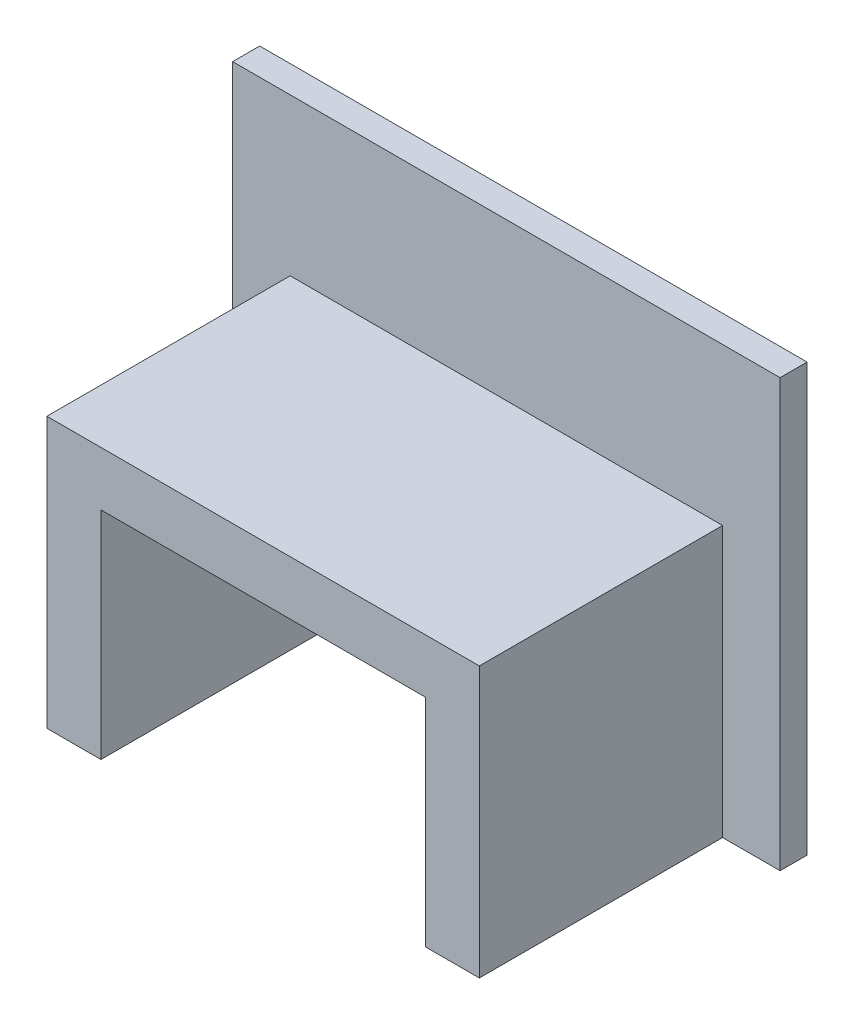
ISO-10303-21;
HEADER;
FILE_DESCRIPTION(('STEP AP214'),'2;1');
FILE_NAME('part.step','',(''),(''),'','','');
FILE_SCHEMA(('AUTOMOTIVE_DESIGN { 1 0 10303 214 1 1 1 1 }'));
ENDSEC;
DATA;
#1=APPLICATION_CONTEXT('core data for automotive mechanical design processes');
#2=APPLICATION_PROTOCOL_DEFINITION('international standard','automotive_design',2000,#1);
#3=PRODUCT_CONTEXT('',#1,'mechanical');
#4=PRODUCT('Part','Part','',(#3));
#5=PRODUCT_RELATED_PRODUCT_CATEGORY('part','',(#4));
#6=PRODUCT_DEFINITION_FORMATION('','',#4);
#7=PRODUCT_DEFINITION_CONTEXT('part definition',#1,'design');
#8=PRODUCT_DEFINITION('design','',#6,#7);
#9=PRODUCT_DEFINITION_SHAPE('','',#8);
#10=(LENGTH_UNIT() NAMED_UNIT(*) SI_UNIT(.MILLI.,.METRE.));
#11=(NAMED_UNIT(*) PLANE_ANGLE_UNIT() SI_UNIT($,.RADIAN.));
#12=(NAMED_UNIT(*) SI_UNIT($,.STERADIAN.) SOLID_ANGLE_UNIT());
#13=UNCERTAINTY_MEASURE_WITH_UNIT(LENGTH_MEASURE(1.E-05),#10,'distance_accuracy_value','');
#14=(GEOMETRIC_REPRESENTATION_CONTEXT(3) GLOBAL_UNCERTAINTY_ASSIGNED_CONTEXT((#13)) GLOBAL_UNIT_ASSIGNED_CONTEXT((#10,
#11,#12)) REPRESENTATION_CONTEXT('',''));
#15=CARTESIAN_POINT('',(0.,0.,0.));
#16=DIRECTION('',(0.,0.,1.));
#17=DIRECTION('',(1.,0.,0.));
#18=AXIS2_PLACEMENT_3D('',#15,#16,#17);
#19=CARTESIAN_POINT('',(6.,0.,-103.864963878906));
#20=DIRECTION('',(0.,1.,0.));
#21=DIRECTION('',(-1.,0.,0.));
#22=AXIS2_PLACEMENT_3D('',#19,#20,#21);
#23=PLANE('',#22);
#24=DIRECTION('',(0.,0.,-1.));
#25=VECTOR('',#24,1.);
#26=CARTESIAN_POINT('',(8.,0.,454.944607989649));
#27=LINE('',#26,#25);
#28=CARTESIAN_POINT('',(8.,0.,-103.864963878906));
#29=VERTEX_POINT('',#28);
#30=CARTESIAN_POINT('',(8.,0.,-112.864963878906));
#31=VERTEX_POINT('',#30);
#32=EDGE_CURVE('E150',#29,#31,#27,.T.);
#33=ORIENTED_EDGE('',*,*,#32,.F.);
#34=DIRECTION('',(1.,0.,0.));
#35=VECTOR('',#34,1.);
#36=CARTESIAN_POINT('',(6.,0.,-103.864963878906));
#37=LINE('',#36,#35);
#38=CARTESIAN_POINT('',(6.,0.,-103.864963878906));
#39=VERTEX_POINT('',#38);
#40=EDGE_CURVE('E170',#39,#29,#37,.T.);
#41=ORIENTED_EDGE('',*,*,#40,.F.);
#42=DIRECTION('',(0.,0.,-1.));
#43=VECTOR('',#42,1.);
#44=CARTESIAN_POINT('',(6.,0.,-103.864963878906));
#45=LINE('',#44,#43);
#46=CARTESIAN_POINT('',(6.,0.,-113.864963878905));
#47=VERTEX_POINT('',#46);
#48=EDGE_CURVE('E178',#39,#47,#45,.T.);
#49=ORIENTED_EDGE('',*,*,#48,.T.);
#50=DIRECTION('',(1.,0.,0.));
#51=VECTOR('',#50,1.);
#52=CARTESIAN_POINT('',(6.,0.,-113.864963878905));
#53=LINE('',#52,#51);
#54=CARTESIAN_POINT('',(10.1269763394667,0.,-113.864963878905));
#55=VERTEX_POINT('',#54);
#56=EDGE_CURVE('E179',#47,#55,#53,.T.);
#57=ORIENTED_EDGE('',*,*,#56,.T.);
#58=DIRECTION('',(0.,0.,-1.));
#59=VECTOR('',#58,1.);
#60=CARTESIAN_POINT('',(10.1269763394667,0.,-103.864963878906));
#61=LINE('',#60,#59);
#62=CARTESIAN_POINT('',(10.1269763394667,0.,-112.864963878906));
#63=VERTEX_POINT('',#62);
#64=EDGE_CURVE('E11',#63,#55,#61,.T.);
#65=ORIENTED_EDGE('',*,*,#64,.F.);
#66=DIRECTION('',(1.,0.,0.));
#67=VECTOR('',#66,1.);
#68=CARTESIAN_POINT('',(6.,0.,-112.864963878906));
#69=LINE('',#68,#67);
#70=EDGE_CURVE('E161',#31,#63,#69,.T.);
#71=ORIENTED_EDGE('',*,*,#70,.F.);
#72=EDGE_LOOP('',(#33,#41,#49,#57,#65,#71));
#73=FACE_BOUND('',#72,.T.);
#74=ADVANCED_FACE('F34',(#73),#23,.F.);
#75=CARTESIAN_POINT('',(10.1269763394667,0.,-103.864963878906));
#76=DIRECTION('',(-1.,0.,0.));
#77=DIRECTION('',(0.,-1.,0.));
#78=AXIS2_PLACEMENT_3D('',#75,#76,#77);
#79=PLANE('',#78);
#80=DIRECTION('',(0.,1.,0.));
#81=VECTOR('',#80,1.);
#82=CARTESIAN_POINT('',(10.1269763394667,0.,-112.864963878906));
#83=LINE('',#82,#81);
#84=CARTESIAN_POINT('',(10.1269763394663,15.8,-112.864963878906));
#85=VERTEX_POINT('',#84);
#86=EDGE_CURVE('E163',#63,#85,#83,.T.);
#87=ORIENTED_EDGE('',*,*,#86,.F.);
#88=ORIENTED_EDGE('',*,*,#64,.T.);
#89=DIRECTION('',(0.,1.,0.));
#90=VECTOR('',#89,1.);
#91=CARTESIAN_POINT('',(10.1269763394667,0.,-113.864963878905));
#92=LINE('',#91,#90);
#93=CARTESIAN_POINT('',(10.1269763394663,15.8,-113.864963878905));
#94=VERTEX_POINT('',#93);
#95=EDGE_CURVE('E182',#55,#94,#92,.T.);
#96=ORIENTED_EDGE('',*,*,#95,.T.);
#97=DIRECTION('',(0.,0.,-1.));
#98=VECTOR('',#97,1.);
#99=CARTESIAN_POINT('',(10.1269763394663,15.8,-103.864963878906));
#100=LINE('',#99,#98);
#101=EDGE_CURVE('E41',#85,#94,#100,.T.);
#102=ORIENTED_EDGE('',*,*,#101,.F.);
#103=EDGE_LOOP('',(#87,#88,#96,#102));
#104=FACE_BOUND('',#103,.T.);
#105=ADVANCED_FACE('F220',(#104),#79,.F.);
#106=CARTESIAN_POINT('',(10.1269763394663,15.8,-103.864963878906));
#107=DIRECTION('',(0.,-1.,0.));
#108=DIRECTION('',(0.,0.,-1.));
#109=AXIS2_PLACEMENT_3D('',#106,#107,#108);
#110=PLANE('',#109);
#111=DIRECTION('',(-1.,0.,0.));
#112=VECTOR('',#111,1.);
#113=CARTESIAN_POINT('',(10.1269763394663,15.8,-112.864963878906));
#114=LINE('',#113,#112);
#115=CARTESIAN_POINT('',(-10.1269763394667,15.8,-112.864963878906));
#116=VERTEX_POINT('',#115);
#117=EDGE_CURVE('E165',#85,#116,#114,.T.);
#118=ORIENTED_EDGE('',*,*,#117,.F.);
#119=ORIENTED_EDGE('',*,*,#101,.T.);
#120=DIRECTION('',(-1.,0.,0.));
#121=VECTOR('',#120,1.);
#122=CARTESIAN_POINT('',(10.1269763394663,15.8,-113.864963878905));
#123=LINE('',#122,#121);
#124=CARTESIAN_POINT('',(-10.1269763394667,15.8,-113.864963878905));
#125=VERTEX_POINT('',#124);
#126=EDGE_CURVE('E185',#94,#125,#123,.T.);
#127=ORIENTED_EDGE('',*,*,#126,.T.);
#128=DIRECTION('',(0.,0.,-1.));
#129=VECTOR('',#128,1.);
#130=CARTESIAN_POINT('',(-10.1269763394667,15.8,-103.864963878906));
#131=LINE('',#130,#129);
#132=EDGE_CURVE('E209',#116,#125,#131,.T.);
#133=ORIENTED_EDGE('',*,*,#132,.F.);
#134=EDGE_LOOP('',(#118,#119,#127,#133));
#135=FACE_BOUND('',#134,.T.);
#136=ADVANCED_FACE('F213',(#135),#110,.F.);
#137=CARTESIAN_POINT('',(-10.1269763394667,15.8,-103.864963878906));
#138=DIRECTION('',(1.,0.,0.));
#139=DIRECTION('',(0.,0.,-1.));
#140=AXIS2_PLACEMENT_3D('',#137,#138,#139);
#141=PLANE('',#140);
#142=DIRECTION('',(0.,-1.,0.));
#143=VECTOR('',#142,1.);
#144=CARTESIAN_POINT('',(-10.1269763394667,15.8,-112.864963878906));
#145=LINE('',#144,#143);
#146=CARTESIAN_POINT('',(-10.1269763394667,0.,-112.864963878906));
#147=VERTEX_POINT('',#146);
#148=EDGE_CURVE('E167',#116,#147,#145,.T.);
#149=ORIENTED_EDGE('',*,*,#148,.F.);
#150=ORIENTED_EDGE('',*,*,#132,.T.);
#151=DIRECTION('',(0.,-1.,0.));
#152=VECTOR('',#151,1.);
#153=CARTESIAN_POINT('',(-10.1269763394667,15.8,-113.864963878905));
#154=LINE('',#153,#152);
#155=CARTESIAN_POINT('',(-10.1269763394667,0.,-113.864963878905));
#156=VERTEX_POINT('',#155);
#157=EDGE_CURVE('E188',#125,#156,#154,.T.);
#158=ORIENTED_EDGE('',*,*,#157,.T.);
#159=DIRECTION('',(0.,0.,-1.));
#160=VECTOR('',#159,1.);
#161=CARTESIAN_POINT('',(-10.1269763394667,0.,-103.864963878906));
#162=LINE('',#161,#160);
#163=EDGE_CURVE('E207',#147,#156,#162,.T.);
#164=ORIENTED_EDGE('',*,*,#163,.F.);
#165=EDGE_LOOP('',(#149,#150,#158,#164));
#166=FACE_BOUND('',#165,.T.);
#167=ADVANCED_FACE('F230',(#166),#141,.F.);
#168=CARTESIAN_POINT('',(-10.1269763394667,0.,-103.864963878906));
#169=DIRECTION('',(0.,1.,0.));
#170=DIRECTION('',(-1.,0.,0.));
#171=AXIS2_PLACEMENT_3D('',#168,#169,#170);
#172=PLANE('',#171);
#173=DIRECTION('',(0.,0.,-1.));
#174=VECTOR('',#173,1.);
#175=CARTESIAN_POINT('',(-8.,0.,454.944607989649));
#176=LINE('',#175,#174);
#177=CARTESIAN_POINT('',(-8.,0.,-103.864963878906));
#178=VERTEX_POINT('',#177);
#179=CARTESIAN_POINT('',(-8.,0.,-112.864963878906));
#180=VERTEX_POINT('',#179);
#181=EDGE_CURVE('E48',#178,#180,#176,.T.);
#182=ORIENTED_EDGE('',*,*,#181,.T.);
#183=DIRECTION('',(1.,0.,0.));
#184=VECTOR('',#183,1.);
#185=CARTESIAN_POINT('',(-10.1269763394667,0.,-112.864963878906));
#186=LINE('',#185,#184);
#187=EDGE_CURVE('E135',#147,#180,#186,.T.);
#188=ORIENTED_EDGE('',*,*,#187,.F.);
#189=ORIENTED_EDGE('',*,*,#163,.T.);
#190=DIRECTION('',(1.,0.,0.));
#191=VECTOR('',#190,1.);
#192=CARTESIAN_POINT('',(-10.1269763394667,0.,-113.864963878905));
#193=LINE('',#192,#191);
#194=CARTESIAN_POINT('',(-6.,0.,-113.864963878905));
#195=VERTEX_POINT('',#194);
#196=EDGE_CURVE('E191',#156,#195,#193,.T.);
#197=ORIENTED_EDGE('',*,*,#196,.T.);
#198=DIRECTION('',(0.,0.,-1.));
#199=VECTOR('',#198,1.);
#200=CARTESIAN_POINT('',(-6.,0.,-103.864963878906));
#201=LINE('',#200,#199);
#202=CARTESIAN_POINT('',(-6.,0.,-103.864963878906));
#203=VERTEX_POINT('',#202);
#204=EDGE_CURVE('E204',#203,#195,#201,.T.);
#205=ORIENTED_EDGE('',*,*,#204,.F.);
#206=DIRECTION('',(1.,0.,0.));
#207=VECTOR('',#206,1.);
#208=CARTESIAN_POINT('',(-10.1269763394667,0.,-103.864963878906));
#209=LINE('',#208,#207);
#210=EDGE_CURVE('E95',#178,#203,#209,.T.);
#211=ORIENTED_EDGE('',*,*,#210,.F.);
#212=EDGE_LOOP('',(#182,#188,#189,#197,#205,#211));
#213=FACE_BOUND('',#212,.T.);
#214=ADVANCED_FACE('F232',(#213),#172,.F.);
#215=CARTESIAN_POINT('',(0.,0.,-103.864963878906));
#216=DIRECTION('',(0.,0.,1.));
#217=DIRECTION('',(1.,0.,0.));
#218=AXIS2_PLACEMENT_3D('',#215,#216,#217);
#219=PLANE('',#218);
#220=ORIENTED_EDGE('',*,*,#40,.T.);
#221=DIRECTION('',(0.,-1.,0.));
#222=VECTOR('',#221,1.);
#223=CARTESIAN_POINT('',(8.,10.,-103.864963878906));
#224=LINE('',#223,#222);
#225=CARTESIAN_POINT('',(8.,10.,-103.864963878906));
#226=VERTEX_POINT('',#225);
#227=EDGE_CURVE('E158',#226,#29,#224,.T.);
#228=ORIENTED_EDGE('',*,*,#227,.F.);
#229=DIRECTION('',(1.,0.,0.));
#230=VECTOR('',#229,1.);
#231=CARTESIAN_POINT('',(-8.,10.,-103.864963878906));
#232=LINE('',#231,#230);
#233=CARTESIAN_POINT('',(-8.,10.,-103.864963878906));
#234=VERTEX_POINT('',#233);
#235=EDGE_CURVE('E160',#234,#226,#232,.T.);
#236=ORIENTED_EDGE('',*,*,#235,.F.);
#237=DIRECTION('',(0.,1.,0.));
#238=VECTOR('',#237,1.);
#239=CARTESIAN_POINT('',(-8.,0.,-103.864963878906));
#240=LINE('',#239,#238);
#241=EDGE_CURVE('E149',#178,#234,#240,.T.);
#242=ORIENTED_EDGE('',*,*,#241,.F.);
#243=ORIENTED_EDGE('',*,*,#210,.T.);
#244=DIRECTION('',(0.,1.,0.));
#245=VECTOR('',#244,1.);
#246=CARTESIAN_POINT('',(-6.,8.,-103.864963878906));
#247=LINE('',#246,#245);
#248=CARTESIAN_POINT('',(-6.,8.,-103.864963878906));
#249=VERTEX_POINT('',#248);
#250=EDGE_CURVE('E173',#203,#249,#247,.T.);
#251=ORIENTED_EDGE('',*,*,#250,.T.);
#252=DIRECTION('',(1.,0.,0.));
#253=VECTOR('',#252,1.);
#254=CARTESIAN_POINT('',(6.,8.,-103.864963878906));
#255=LINE('',#254,#253);
#256=CARTESIAN_POINT('',(6.,8.,-103.864963878906));
#257=VERTEX_POINT('',#256);
#258=EDGE_CURVE('E175',#249,#257,#255,.T.);
#259=ORIENTED_EDGE('',*,*,#258,.T.);
#260=DIRECTION('',(0.,-1.,0.));
#261=VECTOR('',#260,1.);
#262=CARTESIAN_POINT('',(6.,0.,-103.864963878906));
#263=LINE('',#262,#261);
#264=EDGE_CURVE('E57',#257,#39,#263,.T.);
#265=ORIENTED_EDGE('',*,*,#264,.T.);
#266=EDGE_LOOP('',(#220,#228,#236,#242,#243,#251,#259,#265));
#267=FACE_BOUND('',#266,.T.);
#268=ADVANCED_FACE('F238',(#267),#219,.T.);
#269=CARTESIAN_POINT('',(-6.,8.,-103.864963878906));
#270=DIRECTION('',(-1.,0.,0.));
#271=DIRECTION('',(0.,-1.,0.));
#272=AXIS2_PLACEMENT_3D('',#269,#270,#271);
#273=PLANE('',#272);
#274=DIRECTION('',(0.,1.,0.));
#275=VECTOR('',#274,1.);
#276=CARTESIAN_POINT('',(-6.,8.,-113.864963878905));
#277=LINE('',#276,#275);
#278=CARTESIAN_POINT('',(-6.,8.,-113.864963878905));
#279=VERTEX_POINT('',#278);
#280=EDGE_CURVE('E193',#195,#279,#277,.T.);
#281=ORIENTED_EDGE('',*,*,#280,.T.);
#282=DIRECTION('',(0.,0.,-1.));
#283=VECTOR('',#282,1.);
#284=CARTESIAN_POINT('',(-6.,8.,-103.864963878906));
#285=LINE('',#284,#283);
#286=EDGE_CURVE('E201',#249,#279,#285,.T.);
#287=ORIENTED_EDGE('',*,*,#286,.F.);
#288=ORIENTED_EDGE('',*,*,#250,.F.);
#289=ORIENTED_EDGE('',*,*,#204,.T.);
#290=EDGE_LOOP('',(#281,#287,#288,#289));
#291=FACE_BOUND('',#290,.T.);
#292=ADVANCED_FACE('F236',(#291),#273,.F.);
#293=CARTESIAN_POINT('',(6.,8.,-103.864963878906));
#294=DIRECTION('',(0.,1.,0.));
#295=DIRECTION('',(-1.,0.,0.));
#296=AXIS2_PLACEMENT_3D('',#293,#294,#295);
#297=PLANE('',#296);
#298=DIRECTION('',(1.,0.,0.));
#299=VECTOR('',#298,1.);
#300=CARTESIAN_POINT('',(6.,8.,-113.864963878905));
#301=LINE('',#300,#299);
#302=CARTESIAN_POINT('',(6.,8.,-113.864963878905));
#303=VERTEX_POINT('',#302);
#304=EDGE_CURVE('E195',#279,#303,#301,.T.);
#305=ORIENTED_EDGE('',*,*,#304,.T.);
#306=DIRECTION('',(0.,0.,-1.));
#307=VECTOR('',#306,1.);
#308=CARTESIAN_POINT('',(6.,8.,-103.864963878906));
#309=LINE('',#308,#307);
#310=EDGE_CURVE('E199',#257,#303,#309,.T.);
#311=ORIENTED_EDGE('',*,*,#310,.F.);
#312=ORIENTED_EDGE('',*,*,#258,.F.);
#313=ORIENTED_EDGE('',*,*,#286,.T.);
#314=EDGE_LOOP('',(#305,#311,#312,#313));
#315=FACE_BOUND('',#314,.T.);
#316=ADVANCED_FACE('F241',(#315),#297,.F.);
#317=CARTESIAN_POINT('',(6.,0.,-103.864963878906));
#318=DIRECTION('',(1.,0.,0.));
#319=DIRECTION('',(0.,0.,-1.));
#320=AXIS2_PLACEMENT_3D('',#317,#318,#319);
#321=PLANE('',#320);
#322=DIRECTION('',(0.,-1.,0.));
#323=VECTOR('',#322,1.);
#324=CARTESIAN_POINT('',(6.,0.,-113.864963878905));
#325=LINE('',#324,#323);
#326=EDGE_CURVE('E89',#303,#47,#325,.T.);
#327=ORIENTED_EDGE('',*,*,#326,.T.);
#328=ORIENTED_EDGE('',*,*,#48,.F.);
#329=ORIENTED_EDGE('',*,*,#264,.F.);
#330=ORIENTED_EDGE('',*,*,#310,.T.);
#331=EDGE_LOOP('',(#327,#328,#329,#330));
#332=FACE_BOUND('',#331,.T.);
#333=ADVANCED_FACE('F243',(#332),#321,.F.);
#334=CARTESIAN_POINT('',(0.,0.,-113.864963878905));
#335=DIRECTION('',(0.,0.,1.));
#336=DIRECTION('',(1.,0.,0.));
#337=AXIS2_PLACEMENT_3D('',#334,#335,#336);
#338=PLANE('',#337);
#339=ORIENTED_EDGE('',*,*,#56,.F.);
#340=ORIENTED_EDGE('',*,*,#326,.F.);
#341=ORIENTED_EDGE('',*,*,#304,.F.);
#342=ORIENTED_EDGE('',*,*,#280,.F.);
#343=ORIENTED_EDGE('',*,*,#196,.F.);
#344=ORIENTED_EDGE('',*,*,#157,.F.);
#345=ORIENTED_EDGE('',*,*,#126,.F.);
#346=ORIENTED_EDGE('',*,*,#95,.F.);
#347=EDGE_LOOP('',(#339,#340,#341,#342,#343,#344,#345,#346));
#348=FACE_BOUND('',#347,.T.);
#349=ADVANCED_FACE('F224',(#348),#338,.F.);
#350=CARTESIAN_POINT('',(8.,10.,454.944607989649));
#351=DIRECTION('',(1.,0.,0.));
#352=DIRECTION('',(0.,0.,-1.));
#353=AXIS2_PLACEMENT_3D('',#350,#351,#352);
#354=PLANE('',#353);
#355=DIRECTION('',(0.,0.,-1.));
#356=VECTOR('',#355,1.);
#357=CARTESIAN_POINT('',(8.,10.,454.944607989649));
#358=LINE('',#357,#356);
#359=CARTESIAN_POINT('',(8.,10.,-112.864963878906));
#360=VERTEX_POINT('',#359);
#361=EDGE_CURVE('E145',#226,#360,#358,.T.);
#362=ORIENTED_EDGE('',*,*,#361,.F.);
#363=ORIENTED_EDGE('',*,*,#227,.T.);
#364=ORIENTED_EDGE('',*,*,#32,.T.);
#365=DIRECTION('',(0.,-1.,0.));
#366=VECTOR('',#365,1.);
#367=CARTESIAN_POINT('',(8.,10.,-112.864963878906));
#368=LINE('',#367,#366);
#369=EDGE_CURVE('E146',#360,#31,#368,.T.);
#370=ORIENTED_EDGE('',*,*,#369,.F.);
#371=EDGE_LOOP('',(#362,#363,#364,#370));
#372=FACE_BOUND('',#371,.T.);
#373=ADVANCED_FACE('F250',(#372),#354,.T.);
#374=CARTESIAN_POINT('',(-8.,10.,454.944607989649));
#375=DIRECTION('',(0.,1.,0.));
#376=DIRECTION('',(-1.,0.,0.));
#377=AXIS2_PLACEMENT_3D('',#374,#375,#376);
#378=PLANE('',#377);
#379=DIRECTION('',(0.,0.,-1.));
#380=VECTOR('',#379,1.);
#381=CARTESIAN_POINT('',(-8.,10.,454.944607989649));
#382=LINE('',#381,#380);
#383=CARTESIAN_POINT('',(-8.,10.,-112.864963878906));
#384=VERTEX_POINT('',#383);
#385=EDGE_CURVE('E142',#234,#384,#382,.T.);
#386=ORIENTED_EDGE('',*,*,#385,.F.);
#387=ORIENTED_EDGE('',*,*,#235,.T.);
#388=ORIENTED_EDGE('',*,*,#361,.T.);
#389=DIRECTION('',(1.,0.,0.));
#390=VECTOR('',#389,1.);
#391=CARTESIAN_POINT('',(-8.,10.,-112.864963878906));
#392=LINE('',#391,#390);
#393=EDGE_CURVE('E132',#384,#360,#392,.T.);
#394=ORIENTED_EDGE('',*,*,#393,.F.);
#395=EDGE_LOOP('',(#386,#387,#388,#394));
#396=FACE_BOUND('',#395,.T.);
#397=ADVANCED_FACE('F141',(#396),#378,.T.);
#398=CARTESIAN_POINT('',(-8.,0.,454.944607989649));
#399=DIRECTION('',(-1.,0.,0.));
#400=DIRECTION('',(0.,0.,1.));
#401=AXIS2_PLACEMENT_3D('',#398,#399,#400);
#402=PLANE('',#401);
#403=ORIENTED_EDGE('',*,*,#181,.F.);
#404=ORIENTED_EDGE('',*,*,#241,.T.);
#405=ORIENTED_EDGE('',*,*,#385,.T.);
#406=DIRECTION('',(0.,1.,0.));
#407=VECTOR('',#406,1.);
#408=CARTESIAN_POINT('',(-8.,0.,-112.864963878906));
#409=LINE('',#408,#407);
#410=EDGE_CURVE('E129',#180,#384,#409,.T.);
#411=ORIENTED_EDGE('',*,*,#410,.F.);
#412=EDGE_LOOP('',(#403,#404,#405,#411));
#413=FACE_BOUND('',#412,.T.);
#414=ADVANCED_FACE('F148',(#413),#402,.T.);
#415=CARTESIAN_POINT('',(0.,0.,-112.864963878906));
#416=DIRECTION('',(0.,0.,1.));
#417=DIRECTION('',(1.,0.,0.));
#418=AXIS2_PLACEMENT_3D('',#415,#416,#417);
#419=PLANE('',#418);
#420=ORIENTED_EDGE('',*,*,#410,.T.);
#421=ORIENTED_EDGE('',*,*,#393,.T.);
#422=ORIENTED_EDGE('',*,*,#369,.T.);
#423=ORIENTED_EDGE('',*,*,#70,.T.);
#424=ORIENTED_EDGE('',*,*,#86,.T.);
#425=ORIENTED_EDGE('',*,*,#117,.T.);
#426=ORIENTED_EDGE('',*,*,#148,.T.);
#427=ORIENTED_EDGE('',*,*,#187,.T.);
#428=EDGE_LOOP('',(#420,#421,#422,#423,#424,#425,#426,#427));
#429=FACE_BOUND('',#428,.T.);
#430=ADVANCED_FACE('F131',(#429),#419,.T.);
#431=CLOSED_SHELL('',(#74,#105,#136,#167,#214,#268,#292,#316,#333,#349,#373,#397,#414,#430));
#432=MANIFOLD_SOLID_BREP('B2',#431);
#433=ADVANCED_BREP_SHAPE_REPRESENTATION('',(#18,#432),#14);
#434=SHAPE_DEFINITION_REPRESENTATION(#9,#433);
ENDSEC;
END-ISO-10303-21;
